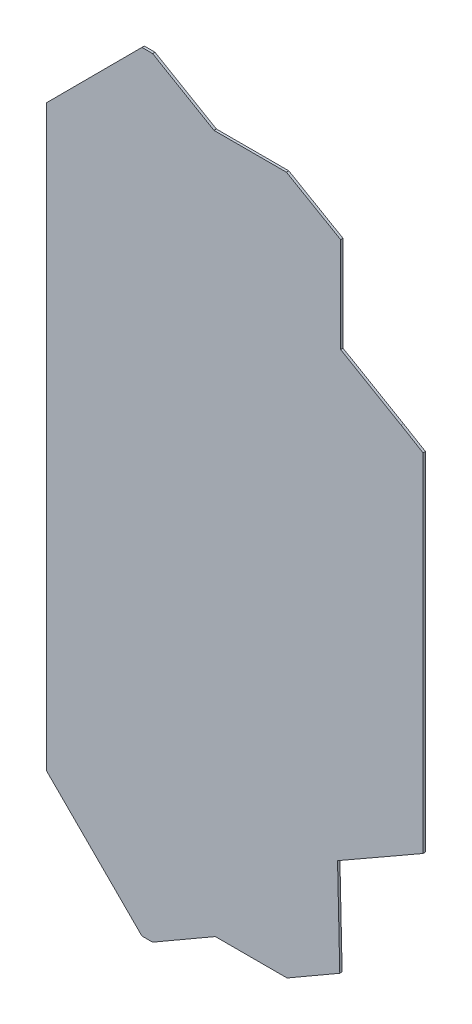
ISO-10303-21;
HEADER;
FILE_DESCRIPTION(('STEP AP214'),'2;1');
FILE_NAME('part.step','',(''),(''),'','','');
FILE_SCHEMA(('AUTOMOTIVE_DESIGN { 1 0 10303 214 1 1 1 1 }'));
ENDSEC;
DATA;
#1=APPLICATION_CONTEXT('core data for automotive mechanical design processes');
#2=APPLICATION_PROTOCOL_DEFINITION('international standard','automotive_design',2000,#1);
#3=PRODUCT_CONTEXT('',#1,'mechanical');
#4=PRODUCT('Part','Part','',(#3));
#5=PRODUCT_RELATED_PRODUCT_CATEGORY('part','',(#4));
#6=PRODUCT_DEFINITION_FORMATION('','',#4);
#7=PRODUCT_DEFINITION_CONTEXT('part definition',#1,'design');
#8=PRODUCT_DEFINITION('design','',#6,#7);
#9=PRODUCT_DEFINITION_SHAPE('','',#8);
#10=(LENGTH_UNIT() NAMED_UNIT(*) SI_UNIT(.MILLI.,.METRE.));
#11=(NAMED_UNIT(*) PLANE_ANGLE_UNIT() SI_UNIT($,.RADIAN.));
#12=(NAMED_UNIT(*) SI_UNIT($,.STERADIAN.) SOLID_ANGLE_UNIT());
#13=UNCERTAINTY_MEASURE_WITH_UNIT(LENGTH_MEASURE(1.E-05),#10,'distance_accuracy_value','');
#14=(GEOMETRIC_REPRESENTATION_CONTEXT(3) GLOBAL_UNCERTAINTY_ASSIGNED_CONTEXT((#13)) GLOBAL_UNIT_ASSIGNED_CONTEXT((#10,
#11,#12)) REPRESENTATION_CONTEXT('',''));
#15=CARTESIAN_POINT('',(0.,0.,0.));
#16=DIRECTION('',(0.,0.,1.));
#17=DIRECTION('',(1.,0.,0.));
#18=AXIS2_PLACEMENT_3D('',#15,#16,#17);
#19=CARTESIAN_POINT('',(143.408151904667,-856.179190344569,2.));
#20=DIRECTION('',(-0.707106781186538,-0.707106781186557,0.));
#21=DIRECTION('',(0.707106781186557,-0.707106781186538,0.));
#22=AXIS2_PLACEMENT_3D('',#19,#20,#21);
#23=PLANE('',#22);
#24=DIRECTION('',(-0.707106781186557,0.707106781186538,0.));
#25=VECTOR('',#24,1.);
#26=CARTESIAN_POINT('',(143.408151904667,-856.179190344569,0.));
#27=LINE('',#26,#25);
#28=CARTESIAN_POINT('',(143.408151904667,-856.179190344569,0.));
#29=VERTEX_POINT('',#28);
#30=CARTESIAN_POINT('',(63.1369871480392,-775.908025587943,0.));
#31=VERTEX_POINT('',#30);
#32=EDGE_CURVE('E196',#29,#31,#27,.T.);
#33=ORIENTED_EDGE('',*,*,#32,.F.);
#34=DIRECTION('',(0.,0.,-1.));
#35=VECTOR('',#34,1.);
#36=CARTESIAN_POINT('',(143.408151904667,-856.179190344569,2.));
#37=LINE('',#36,#35);
#38=CARTESIAN_POINT('',(143.408151904667,-856.179190344569,2.));
#39=VERTEX_POINT('',#38);
#40=EDGE_CURVE('E11',#39,#29,#37,.T.);
#41=ORIENTED_EDGE('',*,*,#40,.F.);
#42=DIRECTION('',(-0.707106781186557,0.707106781186538,0.));
#43=VECTOR('',#42,1.);
#44=CARTESIAN_POINT('',(143.408151904667,-856.179190344569,2.));
#45=LINE('',#44,#43);
#46=CARTESIAN_POINT('',(63.1369871480392,-775.908025587943,2.));
#47=VERTEX_POINT('',#46);
#48=EDGE_CURVE('E260',#39,#47,#45,.T.);
#49=ORIENTED_EDGE('',*,*,#48,.T.);
#50=DIRECTION('',(0.,0.,-1.));
#51=VECTOR('',#50,1.);
#52=CARTESIAN_POINT('',(63.1369871480392,-775.908025587943,2.));
#53=LINE('',#52,#51);
#54=EDGE_CURVE('E42',#47,#31,#53,.T.);
#55=ORIENTED_EDGE('',*,*,#54,.T.);
#56=EDGE_LOOP('',(#33,#41,#49,#55));
#57=FACE_BOUND('',#56,.T.);
#58=ADVANCED_FACE('F39',(#57),#23,.T.);
#59=CARTESIAN_POINT('',(152.401012428341,-856.179190344569,2.));
#60=DIRECTION('',(0.,-1.,0.));
#61=DIRECTION('',(0.,0.,-1.));
#62=AXIS2_PLACEMENT_3D('',#59,#60,#61);
#63=PLANE('',#62);
#64=DIRECTION('',(-1.,0.,0.));
#65=VECTOR('',#64,1.);
#66=CARTESIAN_POINT('',(152.401012428341,-856.179190344569,0.));
#67=LINE('',#66,#65);
#68=CARTESIAN_POINT('',(152.401012428341,-856.179190344569,0.));
#69=VERTEX_POINT('',#68);
#70=EDGE_CURVE('E257',#69,#29,#67,.T.);
#71=ORIENTED_EDGE('',*,*,#70,.F.);
#72=DIRECTION('',(0.,0.,-1.));
#73=VECTOR('',#72,1.);
#74=CARTESIAN_POINT('',(152.401012428341,-856.179190344569,2.));
#75=LINE('',#74,#73);
#76=CARTESIAN_POINT('',(152.401012428341,-856.179190344569,2.));
#77=VERTEX_POINT('',#76);
#78=EDGE_CURVE('E49',#77,#69,#75,.T.);
#79=ORIENTED_EDGE('',*,*,#78,.F.);
#80=DIRECTION('',(-1.,0.,0.));
#81=VECTOR('',#80,1.);
#82=CARTESIAN_POINT('',(152.401012428341,-856.179190344569,2.));
#83=LINE('',#82,#81);
#84=EDGE_CURVE('E182',#77,#39,#83,.T.);
#85=ORIENTED_EDGE('',*,*,#84,.T.);
#86=ORIENTED_EDGE('',*,*,#40,.T.);
#87=EDGE_LOOP('',(#71,#79,#85,#86));
#88=FACE_BOUND('',#87,.T.);
#89=ADVANCED_FACE('F305',(#88),#63,.T.);
#90=CARTESIAN_POINT('',(205.209876551723,-825.689978427336,2.));
#91=DIRECTION('',(0.500000000000003,-0.866025403784437,0.));
#92=DIRECTION('',(0.866025403784437,0.500000000000003,0.));
#93=AXIS2_PLACEMENT_3D('',#90,#91,#92);
#94=PLANE('',#93);
#95=DIRECTION('',(-0.866025403784437,-0.500000000000003,0.));
#96=VECTOR('',#95,1.);
#97=CARTESIAN_POINT('',(205.209876551723,-825.689978427336,0.));
#98=LINE('',#97,#96);
#99=CARTESIAN_POINT('',(205.209876551723,-825.689978427336,0.));
#100=VERTEX_POINT('',#99);
#101=EDGE_CURVE('E168',#100,#69,#98,.T.);
#102=ORIENTED_EDGE('',*,*,#101,.F.);
#103=DIRECTION('',(0.,0.,-1.));
#104=VECTOR('',#103,1.);
#105=CARTESIAN_POINT('',(205.209876551723,-825.689978427336,2.));
#106=LINE('',#105,#104);
#107=CARTESIAN_POINT('',(205.209876551723,-825.689978427336,2.));
#108=VERTEX_POINT('',#107);
#109=EDGE_CURVE('E163',#108,#100,#106,.T.);
#110=ORIENTED_EDGE('',*,*,#109,.F.);
#111=DIRECTION('',(-0.866025403784437,-0.500000000000003,0.));
#112=VECTOR('',#111,1.);
#113=CARTESIAN_POINT('',(205.209876551723,-825.689978427336,2.));
#114=LINE('',#113,#112);
#115=EDGE_CURVE('E166',#108,#77,#114,.T.);
#116=ORIENTED_EDGE('',*,*,#115,.T.);
#117=ORIENTED_EDGE('',*,*,#78,.T.);
#118=EDGE_LOOP('',(#102,#110,#116,#117));
#119=FACE_BOUND('',#118,.T.);
#120=ADVANCED_FACE('F165',(#119),#94,.T.);
#121=CARTESIAN_POINT('',(265.623696466294,-825.689978427336,2.));
#122=DIRECTION('',(0.,-1.,0.));
#123=DIRECTION('',(0.,0.,-1.));
#124=AXIS2_PLACEMENT_3D('',#121,#122,#123);
#125=PLANE('',#124);
#126=DIRECTION('',(-1.,0.,0.));
#127=VECTOR('',#126,1.);
#128=CARTESIAN_POINT('',(265.623696466294,-825.689978427336,0.));
#129=LINE('',#128,#127);
#130=CARTESIAN_POINT('',(265.623696466294,-825.689978427336,0.));
#131=VERTEX_POINT('',#130);
#132=EDGE_CURVE('E252',#131,#100,#129,.T.);
#133=ORIENTED_EDGE('',*,*,#132,.F.);
#134=DIRECTION('',(0.,0.,-1.));
#135=VECTOR('',#134,1.);
#136=CARTESIAN_POINT('',(265.623696466294,-825.689978427336,2.));
#137=LINE('',#136,#135);
#138=CARTESIAN_POINT('',(265.623696466294,-825.689978427336,2.));
#139=VERTEX_POINT('',#138);
#140=EDGE_CURVE('E174',#139,#131,#137,.T.);
#141=ORIENTED_EDGE('',*,*,#140,.F.);
#142=DIRECTION('',(-1.,0.,0.));
#143=VECTOR('',#142,1.);
#144=CARTESIAN_POINT('',(265.623696466294,-825.689978427336,2.));
#145=LINE('',#144,#143);
#146=EDGE_CURVE('E180',#139,#108,#145,.T.);
#147=ORIENTED_EDGE('',*,*,#146,.T.);
#148=ORIENTED_EDGE('',*,*,#109,.T.);
#149=EDGE_LOOP('',(#133,#141,#147,#148));
#150=FACE_BOUND('',#149,.T.);
#151=ADVANCED_FACE('F185',(#150),#125,.T.);
#152=CARTESIAN_POINT('',(310.006107747341,-800.065781326938,2.));
#153=DIRECTION('',(0.500000000000002,-0.866025403784438,0.));
#154=DIRECTION('',(0.866025403784437,0.500000000000002,0.));
#155=AXIS2_PLACEMENT_3D('',#152,#153,#154);
#156=PLANE('',#155);
#157=DIRECTION('',(-0.866025403784437,-0.500000000000002,0.));
#158=VECTOR('',#157,1.);
#159=CARTESIAN_POINT('',(310.006107747341,-800.065781326938,0.));
#160=LINE('',#159,#158);
#161=CARTESIAN_POINT('',(310.006107747341,-800.065781326938,0.));
#162=VERTEX_POINT('',#161);
#163=EDGE_CURVE('E248',#162,#131,#160,.T.);
#164=ORIENTED_EDGE('',*,*,#163,.F.);
#165=DIRECTION('',(0.,0.,-1.));
#166=VECTOR('',#165,1.);
#167=CARTESIAN_POINT('',(310.006107747341,-800.065781326938,2.));
#168=LINE('',#167,#166);
#169=CARTESIAN_POINT('',(310.006107747341,-800.065781326938,2.));
#170=VERTEX_POINT('',#169);
#171=EDGE_CURVE('E266',#170,#162,#168,.T.);
#172=ORIENTED_EDGE('',*,*,#171,.F.);
#173=DIRECTION('',(-0.866025403784437,-0.500000000000002,0.));
#174=VECTOR('',#173,1.);
#175=CARTESIAN_POINT('',(310.006107747341,-800.065781326938,2.));
#176=LINE('',#175,#174);
#177=EDGE_CURVE('E187',#170,#139,#176,.T.);
#178=ORIENTED_EDGE('',*,*,#177,.T.);
#179=ORIENTED_EDGE('',*,*,#140,.T.);
#180=EDGE_LOOP('',(#164,#172,#178,#179));
#181=FACE_BOUND('',#180,.T.);
#182=ADVANCED_FACE('F318',(#181),#156,.T.);
#183=CARTESIAN_POINT('',(308.129986990612,-718.874076910352,2.));
#184=DIRECTION('',(0.999733133297709,0.0231011295556308,0.));
#185=DIRECTION('',(-0.0231011295556308,0.999733133297709,0.));
#186=AXIS2_PLACEMENT_3D('',#183,#184,#185);
#187=PLANE('',#186);
#188=DIRECTION('',(0.0231011295556308,-0.999733133297709,0.));
#189=VECTOR('',#188,1.);
#190=CARTESIAN_POINT('',(308.129986990612,-718.874076910352,0.));
#191=LINE('',#190,#189);
#192=CARTESIAN_POINT('',(308.129986990612,-718.874076910352,0.));
#193=VERTEX_POINT('',#192);
#194=EDGE_CURVE('E244',#193,#162,#191,.T.);
#195=ORIENTED_EDGE('',*,*,#194,.F.);
#196=DIRECTION('',(0.,0.,-1.));
#197=VECTOR('',#196,1.);
#198=CARTESIAN_POINT('',(308.129986990612,-718.874076910352,2.));
#199=LINE('',#198,#197);
#200=CARTESIAN_POINT('',(308.129986990612,-718.874076910352,2.));
#201=VERTEX_POINT('',#200);
#202=EDGE_CURVE('E269',#201,#193,#199,.T.);
#203=ORIENTED_EDGE('',*,*,#202,.F.);
#204=DIRECTION('',(0.0231011295556308,-0.999733133297709,0.));
#205=VECTOR('',#204,1.);
#206=CARTESIAN_POINT('',(308.129986990612,-718.874076910352,2.));
#207=LINE('',#206,#205);
#208=EDGE_CURVE('E190',#201,#170,#207,.T.);
#209=ORIENTED_EDGE('',*,*,#208,.T.);
#210=ORIENTED_EDGE('',*,*,#171,.T.);
#211=EDGE_LOOP('',(#195,#203,#209,#210));
#212=FACE_BOUND('',#211,.T.);
#213=ADVANCED_FACE('F321',(#212),#187,.T.);
#214=CARTESIAN_POINT('',(380.137424167456,-677.655091144169,2.));
#215=DIRECTION('',(0.496791869561617,-0.867869712766538,0.));
#216=DIRECTION('',(0.867869712766538,0.496791869561617,0.));
#217=AXIS2_PLACEMENT_3D('',#214,#215,#216);
#218=PLANE('',#217);
#219=DIRECTION('',(-0.867869712766538,-0.496791869561617,0.));
#220=VECTOR('',#219,1.);
#221=CARTESIAN_POINT('',(380.137424167456,-677.655091144169,0.));
#222=LINE('',#221,#220);
#223=CARTESIAN_POINT('',(380.137424167456,-677.655091144169,0.));
#224=VERTEX_POINT('',#223);
#225=EDGE_CURVE('E240',#224,#193,#222,.T.);
#226=ORIENTED_EDGE('',*,*,#225,.F.);
#227=DIRECTION('',(0.,0.,-1.));
#228=VECTOR('',#227,1.);
#229=CARTESIAN_POINT('',(380.137424167456,-677.655091144169,2.));
#230=LINE('',#229,#228);
#231=CARTESIAN_POINT('',(380.137424167456,-677.655091144169,2.));
#232=VERTEX_POINT('',#231);
#233=EDGE_CURVE('E272',#232,#224,#230,.T.);
#234=ORIENTED_EDGE('',*,*,#233,.F.);
#235=DIRECTION('',(-0.867869712766538,-0.496791869561617,0.));
#236=VECTOR('',#235,1.);
#237=CARTESIAN_POINT('',(380.137424167456,-677.655091144169,2.));
#238=LINE('',#237,#236);
#239=EDGE_CURVE('E519',#232,#201,#238,.T.);
#240=ORIENTED_EDGE('',*,*,#239,.T.);
#241=ORIENTED_EDGE('',*,*,#202,.T.);
#242=EDGE_LOOP('',(#226,#234,#240,#241));
#243=FACE_BOUND('',#242,.T.);
#244=ADVANCED_FACE('F325',(#243),#218,.T.);
#245=CARTESIAN_POINT('',(380.137424167456,-385.482102825228,2.));
#246=DIRECTION('',(1.,0.,0.));
#247=DIRECTION('',(0.,1.,0.));
#248=AXIS2_PLACEMENT_3D('',#245,#246,#247);
#249=PLANE('',#248);
#250=DIRECTION('',(0.,-1.,0.));
#251=VECTOR('',#250,1.);
#252=CARTESIAN_POINT('',(380.137424167456,-385.482102825228,0.));
#253=LINE('',#252,#251);
#254=CARTESIAN_POINT('',(380.137424167456,-385.482102825228,0.));
#255=VERTEX_POINT('',#254);
#256=EDGE_CURVE('E236',#255,#224,#253,.T.);
#257=ORIENTED_EDGE('',*,*,#256,.F.);
#258=DIRECTION('',(0.,0.,-1.));
#259=VECTOR('',#258,1.);
#260=CARTESIAN_POINT('',(380.137424167456,-385.482102825228,2.));
#261=LINE('',#260,#259);
#262=CARTESIAN_POINT('',(380.137424167456,-385.482102825228,2.));
#263=VERTEX_POINT('',#262);
#264=EDGE_CURVE('E275',#263,#255,#261,.T.);
#265=ORIENTED_EDGE('',*,*,#264,.F.);
#266=DIRECTION('',(0.,-1.,0.));
#267=VECTOR('',#266,1.);
#268=CARTESIAN_POINT('',(380.137424167456,-385.482102825228,2.));
#269=LINE('',#268,#267);
#270=EDGE_CURVE('E512',#263,#232,#269,.T.);
#271=ORIENTED_EDGE('',*,*,#270,.T.);
#272=ORIENTED_EDGE('',*,*,#233,.T.);
#273=EDGE_LOOP('',(#257,#265,#271,#272));
#274=FACE_BOUND('',#273,.T.);
#275=ADVANCED_FACE('F329',(#274),#249,.T.);
#276=CARTESIAN_POINT('',(361.630033999024,-374.454471747815,2.));
#277=DIRECTION('',(0.511872040223039,0.859061705838355,0.));
#278=DIRECTION('',(-0.859061705838355,0.511872040223039,0.));
#279=AXIS2_PLACEMENT_3D('',#276,#277,#278);
#280=PLANE('',#279);
#281=DIRECTION('',(0.859061705838355,-0.511872040223039,0.));
#282=VECTOR('',#281,1.);
#283=CARTESIAN_POINT('',(361.630033999024,-374.454471747815,0.));
#284=LINE('',#283,#282);
#285=CARTESIAN_POINT('',(361.630033999024,-374.454471747815,0.));
#286=VERTEX_POINT('',#285);
#287=EDGE_CURVE('E232',#286,#255,#284,.T.);
#288=ORIENTED_EDGE('',*,*,#287,.F.);
#289=DIRECTION('',(0.,0.,-1.));
#290=VECTOR('',#289,1.);
#291=CARTESIAN_POINT('',(361.630033999024,-374.454471747815,2.));
#292=LINE('',#291,#290);
#293=CARTESIAN_POINT('',(361.630033999024,-374.454471747815,2.));
#294=VERTEX_POINT('',#293);
#295=EDGE_CURVE('E278',#294,#286,#292,.T.);
#296=ORIENTED_EDGE('',*,*,#295,.F.);
#297=DIRECTION('',(0.859061705838355,-0.511872040223039,0.));
#298=VECTOR('',#297,1.);
#299=CARTESIAN_POINT('',(361.630033999024,-374.454471747815,2.));
#300=LINE('',#299,#298);
#301=EDGE_CURVE('E508',#294,#263,#300,.T.);
#302=ORIENTED_EDGE('',*,*,#301,.T.);
#303=ORIENTED_EDGE('',*,*,#264,.T.);
#304=EDGE_LOOP('',(#288,#296,#302,#303));
#305=FACE_BOUND('',#304,.T.);
#306=ADVANCED_FACE('F333',(#305),#280,.T.);
#307=CARTESIAN_POINT('',(310.728556489852,-344.87854063061,2.));
#308=DIRECTION('',(0.502392545125793,0.864639653614168,0.));
#309=DIRECTION('',(-0.864639653614168,0.502392545125793,0.));
#310=AXIS2_PLACEMENT_3D('',#307,#308,#309);
#311=PLANE('',#310);
#312=DIRECTION('',(0.864639653614168,-0.502392545125793,0.));
#313=VECTOR('',#312,1.);
#314=CARTESIAN_POINT('',(310.728556489852,-344.87854063061,0.));
#315=LINE('',#314,#313);
#316=CARTESIAN_POINT('',(310.728556489852,-344.87854063061,0.));
#317=VERTEX_POINT('',#316);
#318=EDGE_CURVE('E228',#317,#286,#315,.T.);
#319=ORIENTED_EDGE('',*,*,#318,.F.);
#320=DIRECTION('',(0.,0.,-1.));
#321=VECTOR('',#320,1.);
#322=CARTESIAN_POINT('',(310.728556489852,-344.87854063061,2.));
#323=LINE('',#322,#321);
#324=CARTESIAN_POINT('',(310.728556489852,-344.87854063061,2.));
#325=VERTEX_POINT('',#324);
#326=EDGE_CURVE('E281',#325,#317,#323,.T.);
#327=ORIENTED_EDGE('',*,*,#326,.F.);
#328=DIRECTION('',(0.864639653614168,-0.502392545125793,0.));
#329=VECTOR('',#328,1.);
#330=CARTESIAN_POINT('',(310.728556489852,-344.87854063061,2.));
#331=LINE('',#330,#329);
#332=EDGE_CURVE('E528',#325,#294,#331,.T.);
#333=ORIENTED_EDGE('',*,*,#332,.T.);
#334=ORIENTED_EDGE('',*,*,#295,.T.);
#335=EDGE_LOOP('',(#319,#327,#333,#334));
#336=FACE_BOUND('',#335,.T.);
#337=ADVANCED_FACE('F337',(#336),#311,.T.);
#338=CARTESIAN_POINT('',(310.728556489852,-264.709268318747,2.));
#339=DIRECTION('',(1.,0.,0.));
#340=DIRECTION('',(0.,0.,-1.));
#341=AXIS2_PLACEMENT_3D('',#338,#339,#340);
#342=PLANE('',#341);
#343=DIRECTION('',(0.,-1.,0.));
#344=VECTOR('',#343,1.);
#345=CARTESIAN_POINT('',(310.728556489852,-264.709268318747,0.));
#346=LINE('',#345,#344);
#347=CARTESIAN_POINT('',(310.728556489852,-264.709268318747,0.));
#348=VERTEX_POINT('',#347);
#349=EDGE_CURVE('E224',#348,#317,#346,.T.);
#350=ORIENTED_EDGE('',*,*,#349,.F.);
#351=DIRECTION('',(0.,0.,-1.));
#352=VECTOR('',#351,1.);
#353=CARTESIAN_POINT('',(310.728556489852,-264.709268318747,2.));
#354=LINE('',#353,#352);
#355=CARTESIAN_POINT('',(310.728556489852,-264.709268318747,2.));
#356=VERTEX_POINT('',#355);
#357=EDGE_CURVE('E284',#356,#348,#354,.T.);
#358=ORIENTED_EDGE('',*,*,#357,.F.);
#359=DIRECTION('',(0.,-1.,0.));
#360=VECTOR('',#359,1.);
#361=CARTESIAN_POINT('',(310.728556489852,-264.709268318747,2.));
#362=LINE('',#361,#360);
#363=EDGE_CURVE('E501',#356,#325,#362,.T.);
#364=ORIENTED_EDGE('',*,*,#363,.T.);
#365=ORIENTED_EDGE('',*,*,#326,.T.);
#366=EDGE_LOOP('',(#350,#358,#364,#365));
#367=FACE_BOUND('',#366,.T.);
#368=ADVANCED_FACE('F341',(#367),#342,.T.);
#369=CARTESIAN_POINT('',(265.083006273716,-238.355797614152,2.));
#370=DIRECTION('',(0.500000000000001,0.866025403784438,0.));
#371=DIRECTION('',(-0.866025403784438,0.500000000000001,0.));
#372=AXIS2_PLACEMENT_3D('',#369,#370,#371);
#373=PLANE('',#372);
#374=DIRECTION('',(0.866025403784438,-0.500000000000001,0.));
#375=VECTOR('',#374,1.);
#376=CARTESIAN_POINT('',(265.083006273716,-238.355797614152,0.));
#377=LINE('',#376,#375);
#378=CARTESIAN_POINT('',(265.083006273716,-238.355797614152,0.));
#379=VERTEX_POINT('',#378);
#380=EDGE_CURVE('E220',#379,#348,#377,.T.);
#381=ORIENTED_EDGE('',*,*,#380,.F.);
#382=DIRECTION('',(0.,0.,-1.));
#383=VECTOR('',#382,1.);
#384=CARTESIAN_POINT('',(265.083006273716,-238.355797614152,2.));
#385=LINE('',#384,#383);
#386=CARTESIAN_POINT('',(265.083006273716,-238.355797614152,2.));
#387=VERTEX_POINT('',#386);
#388=EDGE_CURVE('E287',#387,#379,#385,.T.);
#389=ORIENTED_EDGE('',*,*,#388,.F.);
#390=DIRECTION('',(0.866025403784438,-0.500000000000001,0.));
#391=VECTOR('',#390,1.);
#392=CARTESIAN_POINT('',(265.083006273716,-238.355797614152,2.));
#393=LINE('',#392,#391);
#394=EDGE_CURVE('E497',#387,#356,#393,.T.);
#395=ORIENTED_EDGE('',*,*,#394,.T.);
#396=ORIENTED_EDGE('',*,*,#357,.T.);
#397=EDGE_LOOP('',(#381,#389,#395,#396));
#398=FACE_BOUND('',#397,.T.);
#399=ADVANCED_FACE('F345',(#398),#373,.T.);
#400=CARTESIAN_POINT('',(204.095362302535,-238.355797614152,2.));
#401=DIRECTION('',(0.,1.,0.));
#402=DIRECTION('',(0.,0.,1.));
#403=AXIS2_PLACEMENT_3D('',#400,#401,#402);
#404=PLANE('',#403);
#405=DIRECTION('',(1.,0.,0.));
#406=VECTOR('',#405,1.);
#407=CARTESIAN_POINT('',(204.095362302535,-238.355797614152,0.));
#408=LINE('',#407,#406);
#409=CARTESIAN_POINT('',(204.095362302535,-238.355797614152,0.));
#410=VERTEX_POINT('',#409);
#411=EDGE_CURVE('E216',#410,#379,#408,.T.);
#412=ORIENTED_EDGE('',*,*,#411,.F.);
#413=DIRECTION('',(0.,0.,-1.));
#414=VECTOR('',#413,1.);
#415=CARTESIAN_POINT('',(204.095362302535,-238.355797614152,2.));
#416=LINE('',#415,#414);
#417=CARTESIAN_POINT('',(204.095362302535,-238.355797614152,2.));
#418=VERTEX_POINT('',#417);
#419=EDGE_CURVE('E290',#418,#410,#416,.T.);
#420=ORIENTED_EDGE('',*,*,#419,.F.);
#421=DIRECTION('',(1.,0.,0.));
#422=VECTOR('',#421,1.);
#423=CARTESIAN_POINT('',(204.095362302535,-238.355797614152,2.));
#424=LINE('',#423,#422);
#425=EDGE_CURVE('E535',#418,#387,#424,.T.);
#426=ORIENTED_EDGE('',*,*,#425,.T.);
#427=ORIENTED_EDGE('',*,*,#388,.T.);
#428=EDGE_LOOP('',(#412,#420,#426,#427));
#429=FACE_BOUND('',#428,.T.);
#430=ADVANCED_FACE('F349',(#429),#404,.T.);
#431=CARTESIAN_POINT('',(152.401012428341,-208.178753325152,2.));
#432=DIRECTION('',(0.50414531055974,0.86361884291661,0.));
#433=DIRECTION('',(-0.86361884291661,0.50414531055974,0.));
#434=AXIS2_PLACEMENT_3D('',#431,#432,#433);
#435=PLANE('',#434);
#436=DIRECTION('',(0.86361884291661,-0.50414531055974,0.));
#437=VECTOR('',#436,1.);
#438=CARTESIAN_POINT('',(152.401012428341,-208.178753325152,0.));
#439=LINE('',#438,#437);
#440=CARTESIAN_POINT('',(152.401012428341,-208.178753325152,0.));
#441=VERTEX_POINT('',#440);
#442=EDGE_CURVE('E212',#441,#410,#439,.T.);
#443=ORIENTED_EDGE('',*,*,#442,.F.);
#444=DIRECTION('',(0.,0.,-1.));
#445=VECTOR('',#444,1.);
#446=CARTESIAN_POINT('',(152.401012428341,-208.178753325152,2.));
#447=LINE('',#446,#445);
#448=CARTESIAN_POINT('',(152.401012428341,-208.178753325152,2.));
#449=VERTEX_POINT('',#448);
#450=EDGE_CURVE('E293',#449,#441,#447,.T.);
#451=ORIENTED_EDGE('',*,*,#450,.F.);
#452=DIRECTION('',(0.86361884291661,-0.50414531055974,0.));
#453=VECTOR('',#452,1.);
#454=CARTESIAN_POINT('',(152.401012428341,-208.178753325152,2.));
#455=LINE('',#454,#453);
#456=EDGE_CURVE('E490',#449,#418,#455,.T.);
#457=ORIENTED_EDGE('',*,*,#456,.T.);
#458=ORIENTED_EDGE('',*,*,#419,.T.);
#459=EDGE_LOOP('',(#443,#451,#457,#458));
#460=FACE_BOUND('',#459,.T.);
#461=ADVANCED_FACE('F353',(#460),#435,.T.);
#462=CARTESIAN_POINT('',(143.408151904667,-208.178753325152,2.));
#463=DIRECTION('',(0.,1.,0.));
#464=DIRECTION('',(0.,0.,1.));
#465=AXIS2_PLACEMENT_3D('',#462,#463,#464);
#466=PLANE('',#465);
#467=DIRECTION('',(1.,0.,0.));
#468=VECTOR('',#467,1.);
#469=CARTESIAN_POINT('',(143.408151904667,-208.178753325152,0.));
#470=LINE('',#469,#468);
#471=CARTESIAN_POINT('',(143.408151904667,-208.178753325152,0.));
#472=VERTEX_POINT('',#471);
#473=EDGE_CURVE('E208',#472,#441,#470,.T.);
#474=ORIENTED_EDGE('',*,*,#473,.F.);
#475=DIRECTION('',(0.,0.,-1.));
#476=VECTOR('',#475,1.);
#477=CARTESIAN_POINT('',(143.408151904667,-208.178753325152,2.));
#478=LINE('',#477,#476);
#479=CARTESIAN_POINT('',(143.408151904667,-208.178753325152,2.));
#480=VERTEX_POINT('',#479);
#481=EDGE_CURVE('E296',#480,#472,#478,.T.);
#482=ORIENTED_EDGE('',*,*,#481,.F.);
#483=DIRECTION('',(1.,0.,0.));
#484=VECTOR('',#483,1.);
#485=CARTESIAN_POINT('',(143.408151904667,-208.178753325152,2.));
#486=LINE('',#485,#484);
#487=EDGE_CURVE('E486',#480,#449,#486,.T.);
#488=ORIENTED_EDGE('',*,*,#487,.T.);
#489=ORIENTED_EDGE('',*,*,#450,.T.);
#490=EDGE_LOOP('',(#474,#482,#488,#489));
#491=FACE_BOUND('',#490,.T.);
#492=ADVANCED_FACE('F357',(#491),#466,.T.);
#493=CARTESIAN_POINT('',(63.1369871480392,-288.672979408702,2.));
#494=DIRECTION('',(-0.708087207388941,0.706124993703049,0.));
#495=DIRECTION('',(-0.706124993703049,-0.708087207388941,0.));
#496=AXIS2_PLACEMENT_3D('',#493,#494,#495);
#497=PLANE('',#496);
#498=DIRECTION('',(0.706124993703049,0.708087207388941,0.));
#499=VECTOR('',#498,1.);
#500=CARTESIAN_POINT('',(63.1369871480392,-288.672979408702,0.));
#501=LINE('',#500,#499);
#502=CARTESIAN_POINT('',(63.1369871480392,-288.672979408702,0.));
#503=VERTEX_POINT('',#502);
#504=EDGE_CURVE('E204',#503,#472,#501,.T.);
#505=ORIENTED_EDGE('',*,*,#504,.F.);
#506=DIRECTION('',(0.,0.,-1.));
#507=VECTOR('',#506,1.);
#508=CARTESIAN_POINT('',(63.1369871480392,-288.672979408702,2.));
#509=LINE('',#508,#507);
#510=CARTESIAN_POINT('',(63.1369871480392,-288.672979408702,2.));
#511=VERTEX_POINT('',#510);
#512=EDGE_CURVE('E298',#511,#503,#509,.T.);
#513=ORIENTED_EDGE('',*,*,#512,.F.);
#514=DIRECTION('',(0.706124993703049,0.708087207388941,0.));
#515=VECTOR('',#514,1.);
#516=CARTESIAN_POINT('',(63.1369871480392,-288.672979408702,2.));
#517=LINE('',#516,#515);
#518=EDGE_CURVE('E542',#511,#480,#517,.T.);
#519=ORIENTED_EDGE('',*,*,#518,.T.);
#520=ORIENTED_EDGE('',*,*,#481,.T.);
#521=EDGE_LOOP('',(#505,#513,#519,#520));
#522=FACE_BOUND('',#521,.T.);
#523=ADVANCED_FACE('F361',(#522),#497,.T.);
#524=CARTESIAN_POINT('',(63.1369871480392,-775.908025587943,2.));
#525=DIRECTION('',(-1.,0.,0.));
#526=DIRECTION('',(0.,0.,1.));
#527=AXIS2_PLACEMENT_3D('',#524,#525,#526);
#528=PLANE('',#527);
#529=DIRECTION('',(0.,1.,0.));
#530=VECTOR('',#529,1.);
#531=CARTESIAN_POINT('',(63.1369871480392,-775.908025587943,0.));
#532=LINE('',#531,#530);
#533=EDGE_CURVE('E200',#31,#503,#532,.T.);
#534=ORIENTED_EDGE('',*,*,#533,.F.);
#535=ORIENTED_EDGE('',*,*,#54,.F.);
#536=DIRECTION('',(0.,1.,0.));
#537=VECTOR('',#536,1.);
#538=CARTESIAN_POINT('',(63.1369871480392,-775.908025587943,2.));
#539=LINE('',#538,#537);
#540=EDGE_CURVE('E545',#47,#511,#539,.T.);
#541=ORIENTED_EDGE('',*,*,#540,.T.);
#542=ORIENTED_EDGE('',*,*,#512,.T.);
#543=EDGE_LOOP('',(#534,#535,#541,#542));
#544=FACE_BOUND('',#543,.T.);
#545=ADVANCED_FACE('F302',(#544),#528,.T.);
#546=CARTESIAN_POINT('',(0.,0.,2.));
#547=DIRECTION('',(0.,0.,-1.));
#548=DIRECTION('',(-1.,0.,0.));
#549=AXIS2_PLACEMENT_3D('',#546,#547,#548);
#550=PLANE('',#549);
#551=ORIENTED_EDGE('',*,*,#48,.F.);
#552=ORIENTED_EDGE('',*,*,#84,.F.);
#553=ORIENTED_EDGE('',*,*,#115,.F.);
#554=ORIENTED_EDGE('',*,*,#146,.F.);
#555=ORIENTED_EDGE('',*,*,#177,.F.);
#556=ORIENTED_EDGE('',*,*,#208,.F.);
#557=ORIENTED_EDGE('',*,*,#239,.F.);
#558=ORIENTED_EDGE('',*,*,#270,.F.);
#559=ORIENTED_EDGE('',*,*,#301,.F.);
#560=ORIENTED_EDGE('',*,*,#332,.F.);
#561=ORIENTED_EDGE('',*,*,#363,.F.);
#562=ORIENTED_EDGE('',*,*,#394,.F.);
#563=ORIENTED_EDGE('',*,*,#425,.F.);
#564=ORIENTED_EDGE('',*,*,#456,.F.);
#565=ORIENTED_EDGE('',*,*,#487,.F.);
#566=ORIENTED_EDGE('',*,*,#518,.F.);
#567=ORIENTED_EDGE('',*,*,#540,.F.);
#568=EDGE_LOOP('',(#551,#552,#553,#554,#555,#556,#557,#558,#559,#560,#561,#562,#563,#564,#565,
#566,#567));
#569=FACE_BOUND('',#568,.T.);
#570=ADVANCED_FACE('F178',(#569),#550,.F.);
#571=CARTESIAN_POINT('',(0.,0.,0.));
#572=DIRECTION('',(0.,0.,-1.));
#573=DIRECTION('',(-1.,0.,0.));
#574=AXIS2_PLACEMENT_3D('',#571,#572,#573);
#575=PLANE('',#574);
#576=ORIENTED_EDGE('',*,*,#32,.T.);
#577=ORIENTED_EDGE('',*,*,#533,.T.);
#578=ORIENTED_EDGE('',*,*,#504,.T.);
#579=ORIENTED_EDGE('',*,*,#473,.T.);
#580=ORIENTED_EDGE('',*,*,#442,.T.);
#581=ORIENTED_EDGE('',*,*,#411,.T.);
#582=ORIENTED_EDGE('',*,*,#380,.T.);
#583=ORIENTED_EDGE('',*,*,#349,.T.);
#584=ORIENTED_EDGE('',*,*,#318,.T.);
#585=ORIENTED_EDGE('',*,*,#287,.T.);
#586=ORIENTED_EDGE('',*,*,#256,.T.);
#587=ORIENTED_EDGE('',*,*,#225,.T.);
#588=ORIENTED_EDGE('',*,*,#194,.T.);
#589=ORIENTED_EDGE('',*,*,#163,.T.);
#590=ORIENTED_EDGE('',*,*,#132,.T.);
#591=ORIENTED_EDGE('',*,*,#101,.T.);
#592=ORIENTED_EDGE('',*,*,#70,.T.);
#593=EDGE_LOOP('',(#576,#577,#578,#579,#580,#581,#582,#583,#584,#585,#586,#587,#588,#589,#590,
#591,#592));
#594=FACE_BOUND('',#593,.T.);
#595=ADVANCED_FACE('F304',(#594),#575,.T.);
#596=CLOSED_SHELL('',(#58,#89,#120,#151,#182,#213,#244,#275,#306,#337,#368,#399,#430,#461,#492,
#523,#545,#570,#595));
#597=MANIFOLD_SOLID_BREP('B2',#596);
#598=ADVANCED_BREP_SHAPE_REPRESENTATION('',(#18,#597),#14);
#599=SHAPE_DEFINITION_REPRESENTATION(#9,#598);
ENDSEC;
END-ISO-10303-21;
